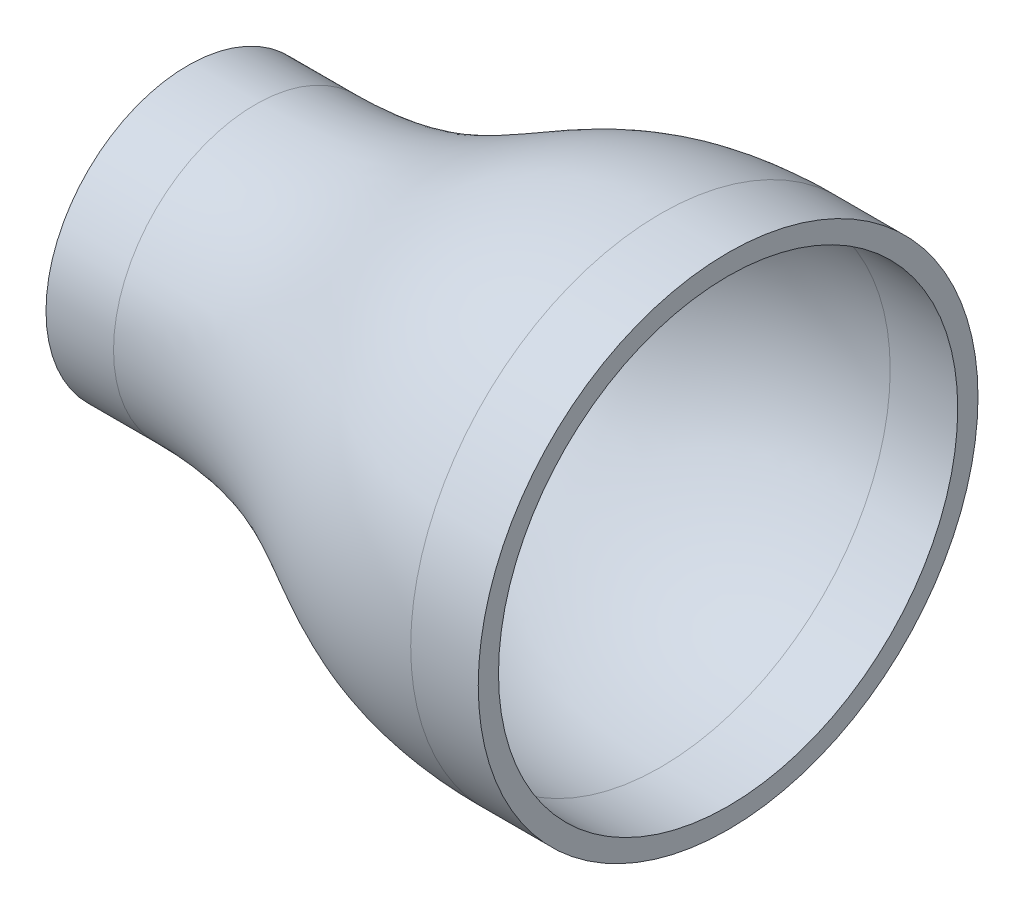
ISO-10303-21;
HEADER;
FILE_DESCRIPTION(('STEP AP214'),'2;1');
FILE_NAME('part.step','',(''),(''),'','','');
FILE_SCHEMA(('AUTOMOTIVE_DESIGN { 1 0 10303 214 1 1 1 1 }'));
ENDSEC;
DATA;
#1=APPLICATION_CONTEXT('core data for automotive mechanical design processes');
#2=APPLICATION_PROTOCOL_DEFINITION('international standard','automotive_design',2000,#1);
#3=PRODUCT_CONTEXT('',#1,'mechanical');
#4=PRODUCT('Part','Part','',(#3));
#5=PRODUCT_RELATED_PRODUCT_CATEGORY('part','',(#4));
#6=PRODUCT_DEFINITION_FORMATION('','',#4);
#7=PRODUCT_DEFINITION_CONTEXT('part definition',#1,'design');
#8=PRODUCT_DEFINITION('design','',#6,#7);
#9=PRODUCT_DEFINITION_SHAPE('','',#8);
#10=(LENGTH_UNIT() NAMED_UNIT(*) SI_UNIT(.MILLI.,.METRE.));
#11=(NAMED_UNIT(*) PLANE_ANGLE_UNIT() SI_UNIT($,.RADIAN.));
#12=(NAMED_UNIT(*) SI_UNIT($,.STERADIAN.) SOLID_ANGLE_UNIT());
#13=UNCERTAINTY_MEASURE_WITH_UNIT(LENGTH_MEASURE(1.E-05),#10,'distance_accuracy_value','');
#14=(GEOMETRIC_REPRESENTATION_CONTEXT(3) GLOBAL_UNCERTAINTY_ASSIGNED_CONTEXT((#13)) GLOBAL_UNIT_ASSIGNED_CONTEXT((#10,
#11,#12)) REPRESENTATION_CONTEXT('',''));
#15=CARTESIAN_POINT('',(0.,0.,0.));
#16=DIRECTION('',(0.,0.,1.));
#17=DIRECTION('',(1.,0.,0.));
#18=AXIS2_PLACEMENT_3D('',#15,#16,#17);
#19=CARTESIAN_POINT('',(30.,0.,-18.5));
#20=CARTESIAN_POINT('',(15.,0.,-18.5));
#21=CARTESIAN_POINT('',(15.,0.,-10.5));
#22=CARTESIAN_POINT('',(0.,0.,-10.5));
#23=B_SPLINE_CURVE_WITH_KNOTS('',3,(#19,#20,#21,#22),.UNSPECIFIED.,.F.,.F.,(4,4),(0.,1.),.UNSPECIFIED.);
#24=CARTESIAN_POINT('',(0.,0.,0.));
#25=DIRECTION('',(-1.,0.,0.));
#26=AXIS1_PLACEMENT('',#24,#25);
#27=SURFACE_OF_REVOLUTION('',#23,#26);
#28=CARTESIAN_POINT('',(0.,0.,0.));
#29=DIRECTION('',(-1.,0.,0.));
#30=DIRECTION('',(0.,0.,1.));
#31=AXIS2_PLACEMENT_3D('',#28,#29,#30);
#32=CIRCLE('',#31,10.5);
#33=CARTESIAN_POINT('',(0.,0.,10.5));
#34=VERTEX_POINT('',#33);
#35=EDGE_CURVE('E60',#34,#34,#32,.T.);
#36=ORIENTED_EDGE('',*,*,#35,.F.);
#37=EDGE_LOOP('',(#36));
#38=FACE_BOUND('',#37,.T.);
#39=CARTESIAN_POINT('',(30.,0.,0.));
#40=DIRECTION('',(-1.,0.,0.));
#41=DIRECTION('',(0.,0.,1.));
#42=AXIS2_PLACEMENT_3D('',#39,#40,#41);
#43=CIRCLE('',#42,18.5);
#44=CARTESIAN_POINT('',(30.,0.,18.5));
#45=VERTEX_POINT('',#44);
#46=EDGE_CURVE('E10',#45,#45,#43,.T.);
#47=ORIENTED_EDGE('',*,*,#46,.T.);
#48=EDGE_LOOP('',(#47));
#49=FACE_BOUND('',#48,.T.);
#50=ADVANCED_FACE('F31',(#38,#49),#27,.T.);
#51=CARTESIAN_POINT('',(0.,0.,0.));
#52=DIRECTION('',(-1.,0.,0.));
#53=DIRECTION('',(0.,0.,1.));
#54=AXIS2_PLACEMENT_3D('',#51,#52,#53);
#55=CYLINDRICAL_SURFACE('',#54,18.5);
#56=ORIENTED_EDGE('',*,*,#46,.F.);
#57=EDGE_LOOP('',(#56));
#58=FACE_BOUND('',#57,.T.);
#59=CARTESIAN_POINT('',(35.,0.,0.));
#60=DIRECTION('',(-1.,0.,0.));
#61=DIRECTION('',(0.,0.,1.));
#62=AXIS2_PLACEMENT_3D('',#59,#60,#61);
#63=CIRCLE('',#62,18.5);
#64=CARTESIAN_POINT('',(35.,0.,18.5));
#65=VERTEX_POINT('',#64);
#66=EDGE_CURVE('E38',#65,#65,#63,.T.);
#67=ORIENTED_EDGE('',*,*,#66,.T.);
#68=EDGE_LOOP('',(#67));
#69=FACE_BOUND('',#68,.T.);
#70=ADVANCED_FACE('F86',(#58,#69),#55,.T.);
#71=CARTESIAN_POINT('',(35.,0.,-17.));
#72=DIRECTION('',(-1.,0.,0.));
#73=DIRECTION('',(0.,0.,1.));
#74=AXIS2_PLACEMENT_3D('',#71,#72,#73);
#75=PLANE('',#74);
#76=ORIENTED_EDGE('',*,*,#66,.F.);
#77=EDGE_LOOP('',(#76));
#78=FACE_BOUND('',#77,.T.);
#79=CARTESIAN_POINT('',(35.,0.,0.));
#80=DIRECTION('',(-1.,0.,0.));
#81=DIRECTION('',(0.,0.,1.));
#82=AXIS2_PLACEMENT_3D('',#79,#80,#81);
#83=CIRCLE('',#82,17.);
#84=CARTESIAN_POINT('',(35.,0.,17.));
#85=VERTEX_POINT('',#84);
#86=EDGE_CURVE('E42',#85,#85,#83,.T.);
#87=ORIENTED_EDGE('',*,*,#86,.T.);
#88=EDGE_LOOP('',(#87));
#89=FACE_BOUND('',#88,.T.);
#90=ADVANCED_FACE('F83',(#78,#89),#75,.F.);
#91=CARTESIAN_POINT('',(0.,0.,0.));
#92=DIRECTION('',(-1.,0.,0.));
#93=DIRECTION('',(0.,0.,1.));
#94=AXIS2_PLACEMENT_3D('',#91,#92,#93);
#95=CYLINDRICAL_SURFACE('',#94,17.);
#96=ORIENTED_EDGE('',*,*,#86,.F.);
#97=EDGE_LOOP('',(#96));
#98=FACE_BOUND('',#97,.T.);
#99=CARTESIAN_POINT('',(30.,0.,0.));
#100=DIRECTION('',(-1.,0.,0.));
#101=DIRECTION('',(0.,0.,1.));
#102=AXIS2_PLACEMENT_3D('',#99,#100,#101);
#103=CIRCLE('',#102,17.);
#104=CARTESIAN_POINT('',(30.,0.,17.));
#105=VERTEX_POINT('',#104);
#106=EDGE_CURVE('E46',#105,#105,#103,.T.);
#107=ORIENTED_EDGE('',*,*,#106,.T.);
#108=EDGE_LOOP('',(#107));
#109=FACE_BOUND('',#108,.T.);
#110=ADVANCED_FACE('F78',(#98,#109),#95,.F.);
#111=CARTESIAN_POINT('',(0.,0.,-9.));
#112=CARTESIAN_POINT('',(15.,0.,-9.));
#113=CARTESIAN_POINT('',(15.,0.,-17.));
#114=CARTESIAN_POINT('',(30.,0.,-17.));
#115=B_SPLINE_CURVE_WITH_KNOTS('',3,(#111,#112,#113,#114),.UNSPECIFIED.,.F.,.F.,(4,4),(0.,1.),.UNSPECIFIED.);
#116=CARTESIAN_POINT('',(0.,0.,0.));
#117=DIRECTION('',(-1.,0.,0.));
#118=AXIS1_PLACEMENT('',#116,#117);
#119=SURFACE_OF_REVOLUTION('',#115,#118);
#120=ORIENTED_EDGE('',*,*,#106,.F.);
#121=EDGE_LOOP('',(#120));
#122=FACE_BOUND('',#121,.T.);
#123=CARTESIAN_POINT('',(0.,0.,0.));
#124=DIRECTION('',(-1.,0.,0.));
#125=DIRECTION('',(0.,0.,1.));
#126=AXIS2_PLACEMENT_3D('',#123,#124,#125);
#127=CIRCLE('',#126,9.);
#128=CARTESIAN_POINT('',(0.,0.,9.));
#129=VERTEX_POINT('',#128);
#130=EDGE_CURVE('E51',#129,#129,#127,.T.);
#131=ORIENTED_EDGE('',*,*,#130,.T.);
#132=EDGE_LOOP('',(#131));
#133=FACE_BOUND('',#132,.T.);
#134=ADVANCED_FACE('F73',(#122,#133),#119,.T.);
#135=CARTESIAN_POINT('',(0.,0.,0.));
#136=DIRECTION('',(-1.,0.,0.));
#137=DIRECTION('',(0.,0.,1.));
#138=AXIS2_PLACEMENT_3D('',#135,#136,#137);
#139=CYLINDRICAL_SURFACE('',#138,9.);
#140=ORIENTED_EDGE('',*,*,#130,.F.);
#141=EDGE_LOOP('',(#140));
#142=FACE_BOUND('',#141,.T.);
#143=CARTESIAN_POINT('',(-5.,0.,0.));
#144=DIRECTION('',(-1.,0.,0.));
#145=DIRECTION('',(0.,0.,1.));
#146=AXIS2_PLACEMENT_3D('',#143,#144,#145);
#147=CIRCLE('',#146,9.);
#148=CARTESIAN_POINT('',(-5.,0.,9.));
#149=VERTEX_POINT('',#148);
#150=EDGE_CURVE('E54',#149,#149,#147,.T.);
#151=ORIENTED_EDGE('',*,*,#150,.T.);
#152=EDGE_LOOP('',(#151));
#153=FACE_BOUND('',#152,.T.);
#154=ADVANCED_FACE('F77',(#142,#153),#139,.F.);
#155=CARTESIAN_POINT('',(-5.,0.,-9.));
#156=DIRECTION('',(1.,0.,0.));
#157=DIRECTION('',(0.,0.,-1.));
#158=AXIS2_PLACEMENT_3D('',#155,#156,#157);
#159=PLANE('',#158);
#160=ORIENTED_EDGE('',*,*,#150,.F.);
#161=EDGE_LOOP('',(#160));
#162=FACE_BOUND('',#161,.T.);
#163=CARTESIAN_POINT('',(-5.,0.,0.));
#164=DIRECTION('',(-1.,0.,0.));
#165=DIRECTION('',(0.,0.,1.));
#166=AXIS2_PLACEMENT_3D('',#163,#164,#165);
#167=CIRCLE('',#166,10.5);
#168=CARTESIAN_POINT('',(-5.,0.,10.5));
#169=VERTEX_POINT('',#168);
#170=EDGE_CURVE('E57',#169,#169,#167,.T.);
#171=ORIENTED_EDGE('',*,*,#170,.T.);
#172=EDGE_LOOP('',(#171));
#173=FACE_BOUND('',#172,.T.);
#174=ADVANCED_FACE('F100',(#162,#173),#159,.F.);
#175=CARTESIAN_POINT('',(0.,0.,0.));
#176=DIRECTION('',(-1.,0.,0.));
#177=DIRECTION('',(0.,0.,1.));
#178=AXIS2_PLACEMENT_3D('',#175,#176,#177);
#179=CYLINDRICAL_SURFACE('',#178,10.5);
#180=ORIENTED_EDGE('',*,*,#170,.F.);
#181=EDGE_LOOP('',(#180));
#182=FACE_BOUND('',#181,.T.);
#183=ORIENTED_EDGE('',*,*,#35,.T.);
#184=EDGE_LOOP('',(#183));
#185=FACE_BOUND('',#184,.T.);
#186=ADVANCED_FACE('F98',(#182,#185),#179,.T.);
#187=CLOSED_SHELL('',(#50,#70,#90,#110,#134,#154,#174,#186));
#188=MANIFOLD_SOLID_BREP('B2',#187);
#189=ADVANCED_BREP_SHAPE_REPRESENTATION('',(#18,#188),#14);
#190=SHAPE_DEFINITION_REPRESENTATION(#9,#189);
ENDSEC;
END-ISO-10303-21;
